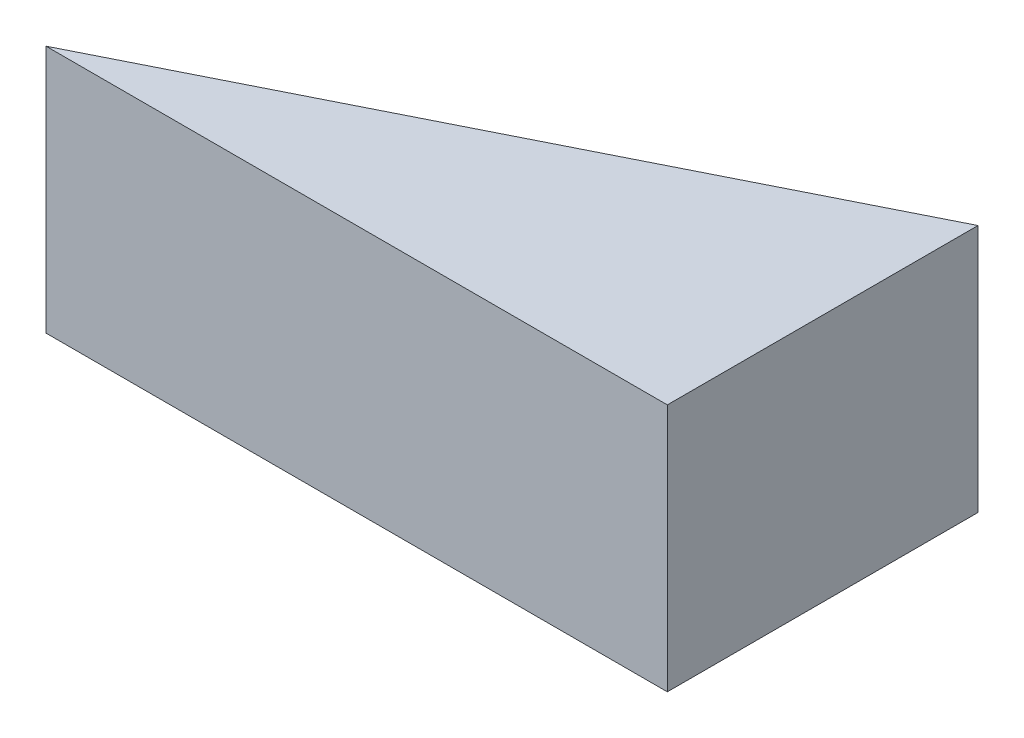
ISO-10303-21;
HEADER;
FILE_DESCRIPTION(('STEP AP214'),'2;1');
FILE_NAME('part.step','',(''),(''),'','','');
FILE_SCHEMA(('AUTOMOTIVE_DESIGN { 1 0 10303 214 1 1 1 1 }'));
ENDSEC;
DATA;
#1=APPLICATION_CONTEXT('core data for automotive mechanical design processes');
#2=APPLICATION_PROTOCOL_DEFINITION('international standard','automotive_design',2000,#1);
#3=PRODUCT_CONTEXT('',#1,'mechanical');
#4=PRODUCT('Part','Part','',(#3));
#5=PRODUCT_RELATED_PRODUCT_CATEGORY('part','',(#4));
#6=PRODUCT_DEFINITION_FORMATION('','',#4);
#7=PRODUCT_DEFINITION_CONTEXT('part definition',#1,'design');
#8=PRODUCT_DEFINITION('design','',#6,#7);
#9=PRODUCT_DEFINITION_SHAPE('','',#8);
#10=(LENGTH_UNIT() NAMED_UNIT(*) SI_UNIT(.MILLI.,.METRE.));
#11=(NAMED_UNIT(*) PLANE_ANGLE_UNIT() SI_UNIT($,.RADIAN.));
#12=(NAMED_UNIT(*) SI_UNIT($,.STERADIAN.) SOLID_ANGLE_UNIT());
#13=UNCERTAINTY_MEASURE_WITH_UNIT(LENGTH_MEASURE(1.E-05),#10,'distance_accuracy_value','');
#14=(GEOMETRIC_REPRESENTATION_CONTEXT(3) GLOBAL_UNCERTAINTY_ASSIGNED_CONTEXT((#13)) GLOBAL_UNIT_ASSIGNED_CONTEXT((#10,
#11,#12)) REPRESENTATION_CONTEXT('',''));
#15=CARTESIAN_POINT('',(0.,0.,0.));
#16=DIRECTION('',(0.,0.,1.));
#17=DIRECTION('',(1.,0.,0.));
#18=AXIS2_PLACEMENT_3D('',#15,#16,#17);
#19=CARTESIAN_POINT('',(-20.,8.,0.));
#20=DIRECTION('',(0.447213595499958,0.,0.894427190999916));
#21=DIRECTION('',(0.894427190999916,0.,-0.447213595499958));
#22=AXIS2_PLACEMENT_3D('',#19,#20,#21);
#23=PLANE('',#22);
#24=DIRECTION('',(-0.894427190999916,0.,0.447213595499958));
#25=VECTOR('',#24,1.);
#26=CARTESIAN_POINT('',(-20.,0.,0.));
#27=LINE('',#26,#25);
#28=CARTESIAN_POINT('',(0.,0.,-10.));
#29=VERTEX_POINT('',#28);
#30=CARTESIAN_POINT('',(-20.,0.,0.));
#31=VERTEX_POINT('',#30);
#32=EDGE_CURVE('E80',#29,#31,#27,.T.);
#33=ORIENTED_EDGE('',*,*,#32,.T.);
#34=DIRECTION('',(0.,-1.,0.));
#35=VECTOR('',#34,1.);
#36=CARTESIAN_POINT('',(-20.,8.,0.));
#37=LINE('',#36,#35);
#38=CARTESIAN_POINT('',(-20.,8.,0.));
#39=VERTEX_POINT('',#38);
#40=EDGE_CURVE('E11',#39,#31,#37,.T.);
#41=ORIENTED_EDGE('',*,*,#40,.F.);
#42=DIRECTION('',(-0.894427190999916,0.,0.447213595499958));
#43=VECTOR('',#42,1.);
#44=CARTESIAN_POINT('',(-20.,8.,0.));
#45=LINE('',#44,#43);
#46=CARTESIAN_POINT('',(0.,8.,-10.));
#47=VERTEX_POINT('',#46);
#48=EDGE_CURVE('E73',#47,#39,#45,.T.);
#49=ORIENTED_EDGE('',*,*,#48,.F.);
#50=DIRECTION('',(0.,-1.,0.));
#51=VECTOR('',#50,1.);
#52=CARTESIAN_POINT('',(0.,8.,-10.));
#53=LINE('',#52,#51);
#54=EDGE_CURVE('E81',#47,#29,#53,.T.);
#55=ORIENTED_EDGE('',*,*,#54,.T.);
#56=EDGE_LOOP('',(#33,#41,#49,#55));
#57=FACE_BOUND('',#56,.T.);
#58=ADVANCED_FACE('F33',(#57),#23,.F.);
#59=CARTESIAN_POINT('',(0.,8.,0.));
#60=DIRECTION('',(0.,0.,-1.));
#61=DIRECTION('',(-1.,0.,0.));
#62=AXIS2_PLACEMENT_3D('',#59,#60,#61);
#63=PLANE('',#62);
#64=DIRECTION('',(1.,0.,0.));
#65=VECTOR('',#64,1.);
#66=CARTESIAN_POINT('',(0.,0.,0.));
#67=LINE('',#66,#65);
#68=CARTESIAN_POINT('',(0.,0.,0.));
#69=VERTEX_POINT('',#68);
#70=EDGE_CURVE('E61',#31,#69,#67,.T.);
#71=ORIENTED_EDGE('',*,*,#70,.T.);
#72=DIRECTION('',(0.,-1.,0.));
#73=VECTOR('',#72,1.);
#74=CARTESIAN_POINT('',(0.,8.,0.));
#75=LINE('',#74,#73);
#76=CARTESIAN_POINT('',(0.,8.,0.));
#77=VERTEX_POINT('',#76);
#78=EDGE_CURVE('E41',#77,#69,#75,.T.);
#79=ORIENTED_EDGE('',*,*,#78,.F.);
#80=DIRECTION('',(1.,0.,0.));
#81=VECTOR('',#80,1.);
#82=CARTESIAN_POINT('',(0.,8.,0.));
#83=LINE('',#82,#81);
#84=EDGE_CURVE('E69',#39,#77,#83,.T.);
#85=ORIENTED_EDGE('',*,*,#84,.F.);
#86=ORIENTED_EDGE('',*,*,#40,.T.);
#87=EDGE_LOOP('',(#71,#79,#85,#86));
#88=FACE_BOUND('',#87,.T.);
#89=ADVANCED_FACE('F70',(#88),#63,.F.);
#90=CARTESIAN_POINT('',(0.,8.,-10.));
#91=DIRECTION('',(-1.,0.,0.));
#92=DIRECTION('',(0.,0.,1.));
#93=AXIS2_PLACEMENT_3D('',#90,#91,#92);
#94=PLANE('',#93);
#95=DIRECTION('',(0.,0.,-1.));
#96=VECTOR('',#95,1.);
#97=CARTESIAN_POINT('',(0.,0.,-10.));
#98=LINE('',#97,#96);
#99=EDGE_CURVE('E66',#69,#29,#98,.T.);
#100=ORIENTED_EDGE('',*,*,#99,.T.);
#101=ORIENTED_EDGE('',*,*,#54,.F.);
#102=DIRECTION('',(0.,0.,-1.));
#103=VECTOR('',#102,1.);
#104=CARTESIAN_POINT('',(0.,8.,-10.));
#105=LINE('',#104,#103);
#106=EDGE_CURVE('E49',#77,#47,#105,.T.);
#107=ORIENTED_EDGE('',*,*,#106,.F.);
#108=ORIENTED_EDGE('',*,*,#78,.T.);
#109=EDGE_LOOP('',(#100,#101,#107,#108));
#110=FACE_BOUND('',#109,.T.);
#111=ADVANCED_FACE('F88',(#110),#94,.F.);
#112=CARTESIAN_POINT('',(0.,8.,0.));
#113=DIRECTION('',(0.,-1.,0.));
#114=DIRECTION('',(0.,0.,-1.));
#115=AXIS2_PLACEMENT_3D('',#112,#113,#114);
#116=PLANE('',#115);
#117=ORIENTED_EDGE('',*,*,#48,.T.);
#118=ORIENTED_EDGE('',*,*,#84,.T.);
#119=ORIENTED_EDGE('',*,*,#106,.T.);
#120=EDGE_LOOP('',(#117,#118,#119));
#121=FACE_BOUND('',#120,.T.);
#122=ADVANCED_FACE('F76',(#121),#116,.F.);
#123=CARTESIAN_POINT('',(0.,0.,0.));
#124=DIRECTION('',(0.,-1.,0.));
#125=DIRECTION('',(0.,0.,-1.));
#126=AXIS2_PLACEMENT_3D('',#123,#124,#125);
#127=PLANE('',#126);
#128=ORIENTED_EDGE('',*,*,#32,.F.);
#129=ORIENTED_EDGE('',*,*,#99,.F.);
#130=ORIENTED_EDGE('',*,*,#70,.F.);
#131=EDGE_LOOP('',(#128,#129,#130));
#132=FACE_BOUND('',#131,.T.);
#133=ADVANCED_FACE('F89',(#132),#127,.T.);
#134=CLOSED_SHELL('',(#58,#89,#111,#122,#133));
#135=MANIFOLD_SOLID_BREP('B2',#134);
#136=ADVANCED_BREP_SHAPE_REPRESENTATION('',(#18,#135),#14);
#137=SHAPE_DEFINITION_REPRESENTATION(#9,#136);
ENDSEC;
END-ISO-10303-21;
